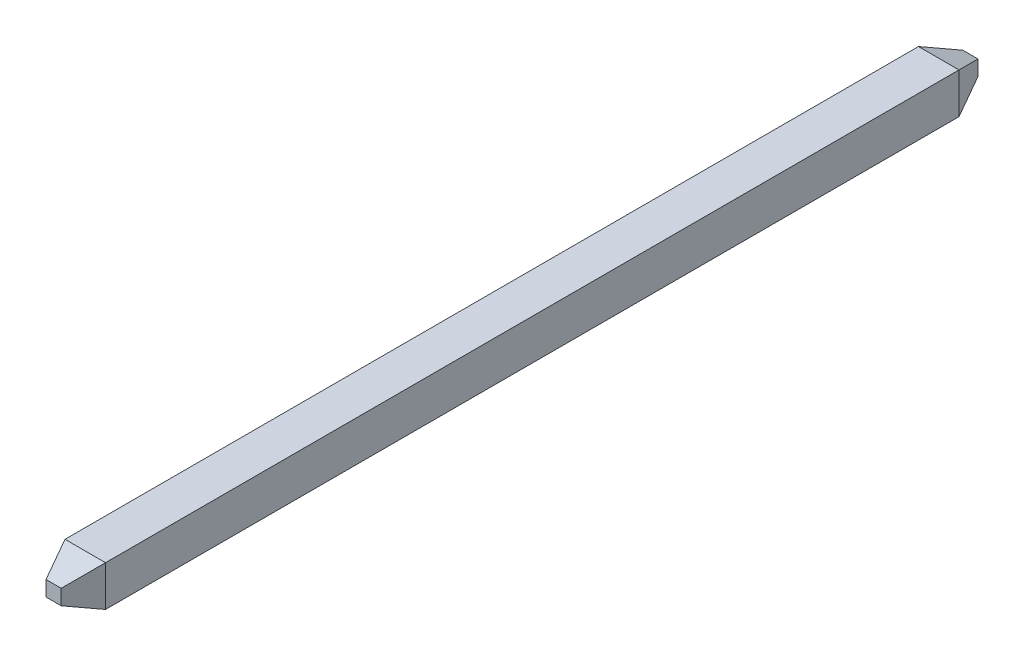
ISO-10303-21;
HEADER;
FILE_DESCRIPTION(('STEP AP214'),'2;1');
FILE_NAME('part.step','',(''),(''),'','','');
FILE_SCHEMA(('AUTOMOTIVE_DESIGN { 1 0 10303 214 1 1 1 1 }'));
ENDSEC;
DATA;
#1=APPLICATION_CONTEXT('core data for automotive mechanical design processes');
#2=APPLICATION_PROTOCOL_DEFINITION('international standard','automotive_design',2000,#1);
#3=PRODUCT_CONTEXT('',#1,'mechanical');
#4=PRODUCT('Part','Part','',(#3));
#5=PRODUCT_RELATED_PRODUCT_CATEGORY('part','',(#4));
#6=PRODUCT_DEFINITION_FORMATION('','',#4);
#7=PRODUCT_DEFINITION_CONTEXT('part definition',#1,'design');
#8=PRODUCT_DEFINITION('design','',#6,#7);
#9=PRODUCT_DEFINITION_SHAPE('','',#8);
#10=(LENGTH_UNIT() NAMED_UNIT(*) SI_UNIT(.MILLI.,.METRE.));
#11=(NAMED_UNIT(*) PLANE_ANGLE_UNIT() SI_UNIT($,.RADIAN.));
#12=(NAMED_UNIT(*) SI_UNIT($,.STERADIAN.) SOLID_ANGLE_UNIT());
#13=UNCERTAINTY_MEASURE_WITH_UNIT(LENGTH_MEASURE(1.E-05),#10,'distance_accuracy_value','');
#14=(GEOMETRIC_REPRESENTATION_CONTEXT(3) GLOBAL_UNCERTAINTY_ASSIGNED_CONTEXT((#13)) GLOBAL_UNIT_ASSIGNED_CONTEXT((#10,
#11,#12)) REPRESENTATION_CONTEXT('',''));
#15=CARTESIAN_POINT('',(0.,0.,0.));
#16=DIRECTION('',(0.,0.,1.));
#17=DIRECTION('',(1.,0.,0.));
#18=AXIS2_PLACEMENT_3D('',#15,#16,#17);
#19=CARTESIAN_POINT('',(-3.59,-0.0200000000000088,-3.31));
#20=DIRECTION('',(0.928476690885259,0.,-0.371390676354104));
#21=DIRECTION('',(-0.371390676354104,0.,-0.928476690885259));
#22=AXIS2_PLACEMENT_3D('',#19,#20,#21);
#23=PLANE('',#22);
#24=DIRECTION('',(0.,1.,0.));
#25=VECTOR('',#24,1.);
#26=CARTESIAN_POINT('',(-3.69,-0.139999999999999,-3.56));
#27=LINE('',#26,#25);
#28=CARTESIAN_POINT('',(-3.69,-0.139999999999999,-3.56));
#29=VERTEX_POINT('',#28);
#30=CARTESIAN_POINT('',(-3.69,0.0999999999999913,-3.56));
#31=VERTEX_POINT('',#30);
#32=EDGE_CURVE('E11',#29,#31,#27,.T.);
#33=ORIENTED_EDGE('',*,*,#32,.T.);
#34=DIRECTION('',(-0.348155311911244,-0.348155311911244,-0.87038827977861));
#35=VECTOR('',#34,1.);
#36=CARTESIAN_POINT('',(-3.49,0.300000000000001,-3.06));
#37=LINE('',#36,#35);
#38=CARTESIAN_POINT('',(-3.49,0.300000000000001,-3.06));
#39=VERTEX_POINT('',#38);
#40=EDGE_CURVE('E24',#39,#31,#37,.T.);
#41=ORIENTED_EDGE('',*,*,#40,.F.);
#42=DIRECTION('',(0.,1.,0.));
#43=VECTOR('',#42,1.);
#44=CARTESIAN_POINT('',(-3.49,-0.339999999999999,-3.06));
#45=LINE('',#44,#43);
#46=CARTESIAN_POINT('',(-3.49,-0.339999999999999,-3.06));
#47=VERTEX_POINT('',#46);
#48=EDGE_CURVE('E154',#47,#39,#45,.T.);
#49=ORIENTED_EDGE('',*,*,#48,.F.);
#50=DIRECTION('',(0.348155311911244,-0.348155311911244,0.87038827977861));
#51=VECTOR('',#50,1.);
#52=CARTESIAN_POINT('',(-3.69,-0.139999999999999,-3.56));
#53=LINE('',#52,#51);
#54=EDGE_CURVE('E151',#29,#47,#53,.T.);
#55=ORIENTED_EDGE('',*,*,#54,.F.);
#56=EDGE_LOOP('',(#33,#41,#49,#55));
#57=FACE_BOUND('',#56,.T.);
#58=ADVANCED_FACE('F17',(#57),#23,.T.);
#59=CARTESIAN_POINT('',(-4.03,-0.0199999999999988,10.67));
#60=DIRECTION('',(-0.928476690885259,0.,0.371390676354104));
#61=DIRECTION('',(0.371390676354104,0.,0.928476690885259));
#62=AXIS2_PLACEMENT_3D('',#59,#60,#61);
#63=PLANE('',#62);
#64=DIRECTION('',(0.,1.,0.));
#65=VECTOR('',#64,1.);
#66=CARTESIAN_POINT('',(-3.93,-0.139999999999999,10.92));
#67=LINE('',#66,#65);
#68=CARTESIAN_POINT('',(-3.93,-0.139999999999999,10.92));
#69=VERTEX_POINT('',#68);
#70=CARTESIAN_POINT('',(-3.93,0.0999999999999912,10.92));
#71=VERTEX_POINT('',#70);
#72=EDGE_CURVE('E149',#69,#71,#67,.T.);
#73=ORIENTED_EDGE('',*,*,#72,.T.);
#74=DIRECTION('',(0.348155311911244,-0.348155311911244,0.87038827977861));
#75=VECTOR('',#74,1.);
#76=CARTESIAN_POINT('',(-4.13,0.300000000000001,10.42));
#77=LINE('',#76,#75);
#78=CARTESIAN_POINT('',(-4.13,0.300000000000001,10.42));
#79=VERTEX_POINT('',#78);
#80=EDGE_CURVE('E146',#79,#71,#77,.T.);
#81=ORIENTED_EDGE('',*,*,#80,.F.);
#82=DIRECTION('',(0.,1.,0.));
#83=VECTOR('',#82,1.);
#84=CARTESIAN_POINT('',(-4.13,-0.339999999999999,10.42));
#85=LINE('',#84,#83);
#86=CARTESIAN_POINT('',(-4.13,-0.339999999999999,10.42));
#87=VERTEX_POINT('',#86);
#88=EDGE_CURVE('E143',#87,#79,#85,.T.);
#89=ORIENTED_EDGE('',*,*,#88,.F.);
#90=DIRECTION('',(-0.348155311911244,-0.348155311911244,-0.87038827977861));
#91=VECTOR('',#90,1.);
#92=CARTESIAN_POINT('',(-3.93,-0.139999999999999,10.92));
#93=LINE('',#92,#91);
#94=EDGE_CURVE('E140',#69,#87,#93,.T.);
#95=ORIENTED_EDGE('',*,*,#94,.F.);
#96=EDGE_LOOP('',(#73,#81,#89,#95));
#97=FACE_BOUND('',#96,.T.);
#98=ADVANCED_FACE('F184',(#97),#63,.T.);
#99=CARTESIAN_POINT('',(-3.81,-0.239999999999999,10.67));
#100=DIRECTION('',(0.,-0.928476690885259,0.371390676354104));
#101=DIRECTION('',(0.,-0.371390676354104,-0.928476690885259));
#102=AXIS2_PLACEMENT_3D('',#99,#100,#101);
#103=PLANE('',#102);
#104=DIRECTION('',(1.,0.,0.));
#105=VECTOR('',#104,1.);
#106=CARTESIAN_POINT('',(-3.93,-0.139999999999999,10.92));
#107=LINE('',#106,#105);
#108=CARTESIAN_POINT('',(-3.69,-0.139999999999999,10.92));
#109=VERTEX_POINT('',#108);
#110=EDGE_CURVE('E138',#69,#109,#107,.T.);
#111=ORIENTED_EDGE('',*,*,#110,.F.);
#112=ORIENTED_EDGE('',*,*,#94,.T.);
#113=DIRECTION('',(1.,0.,0.));
#114=VECTOR('',#113,1.);
#115=CARTESIAN_POINT('',(-4.13,-0.339999999999999,10.42));
#116=LINE('',#115,#114);
#117=CARTESIAN_POINT('',(-3.49,-0.339999999999999,10.42));
#118=VERTEX_POINT('',#117);
#119=EDGE_CURVE('E136',#87,#118,#116,.T.);
#120=ORIENTED_EDGE('',*,*,#119,.T.);
#121=DIRECTION('',(-0.348155311911244,0.348155311911244,0.87038827977861));
#122=VECTOR('',#121,1.);
#123=CARTESIAN_POINT('',(-3.49,-0.339999999999999,10.42));
#124=LINE('',#123,#122);
#125=EDGE_CURVE('E133',#118,#109,#124,.T.);
#126=ORIENTED_EDGE('',*,*,#125,.T.);
#127=EDGE_LOOP('',(#111,#112,#120,#126));
#128=FACE_BOUND('',#127,.T.);
#129=ADVANCED_FACE('F185',(#128),#103,.T.);
#130=CARTESIAN_POINT('',(-3.49,-0.339999999999999,10.92));
#131=DIRECTION('',(0.,0.,1.));
#132=DIRECTION('',(0.,1.,0.));
#133=AXIS2_PLACEMENT_3D('',#130,#131,#132);
#134=PLANE('',#133);
#135=ORIENTED_EDGE('',*,*,#110,.T.);
#136=DIRECTION('',(0.,-1.,0.));
#137=VECTOR('',#136,1.);
#138=CARTESIAN_POINT('',(-3.69,0.0999999999999912,10.92));
#139=LINE('',#138,#137);
#140=CARTESIAN_POINT('',(-3.69,0.0999999999999912,10.92));
#141=VERTEX_POINT('',#140);
#142=EDGE_CURVE('E130',#141,#109,#139,.T.);
#143=ORIENTED_EDGE('',*,*,#142,.F.);
#144=DIRECTION('',(1.,0.,0.));
#145=VECTOR('',#144,1.);
#146=CARTESIAN_POINT('',(-3.93,0.0999999999999912,10.92));
#147=LINE('',#146,#145);
#148=EDGE_CURVE('E127',#71,#141,#147,.T.);
#149=ORIENTED_EDGE('',*,*,#148,.F.);
#150=ORIENTED_EDGE('',*,*,#72,.F.);
#151=EDGE_LOOP('',(#135,#143,#149,#150));
#152=FACE_BOUND('',#151,.T.);
#153=ADVANCED_FACE('F187',(#152),#134,.T.);
#154=CARTESIAN_POINT('',(-3.81,0.200000000000001,10.67));
#155=DIRECTION('',(0.,0.928476690885259,0.371390676354104));
#156=DIRECTION('',(0.,-0.371390676354104,0.928476690885259));
#157=AXIS2_PLACEMENT_3D('',#154,#155,#156);
#158=PLANE('',#157);
#159=DIRECTION('',(1.,0.,0.));
#160=VECTOR('',#159,1.);
#161=CARTESIAN_POINT('',(-4.13,0.300000000000001,10.42));
#162=LINE('',#161,#160);
#163=CARTESIAN_POINT('',(-3.49,0.300000000000001,10.42));
#164=VERTEX_POINT('',#163);
#165=EDGE_CURVE('E125',#79,#164,#162,.T.);
#166=ORIENTED_EDGE('',*,*,#165,.F.);
#167=ORIENTED_EDGE('',*,*,#80,.T.);
#168=ORIENTED_EDGE('',*,*,#148,.T.);
#169=DIRECTION('',(0.348155311911244,0.348155311911244,-0.87038827977861));
#170=VECTOR('',#169,1.);
#171=CARTESIAN_POINT('',(-3.69,0.0999999999999912,10.92));
#172=LINE('',#171,#170);
#173=EDGE_CURVE('E122',#141,#164,#172,.T.);
#174=ORIENTED_EDGE('',*,*,#173,.T.);
#175=EDGE_LOOP('',(#166,#167,#168,#174));
#176=FACE_BOUND('',#175,.T.);
#177=ADVANCED_FACE('F167',(#176),#158,.T.);
#178=CARTESIAN_POINT('',(-3.49,-0.339999999999999,-3.56));
#179=DIRECTION('',(0.,-1.,0.));
#180=DIRECTION('',(0.,0.,1.));
#181=AXIS2_PLACEMENT_3D('',#178,#179,#180);
#182=PLANE('',#181);
#183=DIRECTION('',(0.,0.,1.));
#184=VECTOR('',#183,1.);
#185=CARTESIAN_POINT('',(-3.49,-0.339999999999999,3.16));
#186=LINE('',#185,#184);
#187=EDGE_CURVE('E119',#47,#118,#186,.T.);
#188=ORIENTED_EDGE('',*,*,#187,.T.);
#189=ORIENTED_EDGE('',*,*,#119,.F.);
#190=DIRECTION('',(0.,0.,1.));
#191=VECTOR('',#190,1.);
#192=CARTESIAN_POINT('',(-4.13,-0.339999999999999,-3.06));
#193=LINE('',#192,#191);
#194=CARTESIAN_POINT('',(-4.13,-0.339999999999999,-3.06));
#195=VERTEX_POINT('',#194);
#196=EDGE_CURVE('E116',#195,#87,#193,.T.);
#197=ORIENTED_EDGE('',*,*,#196,.F.);
#198=DIRECTION('',(1.,0.,0.));
#199=VECTOR('',#198,1.);
#200=CARTESIAN_POINT('',(-4.13,-0.339999999999999,-3.06));
#201=LINE('',#200,#199);
#202=EDGE_CURVE('E113',#195,#47,#201,.T.);
#203=ORIENTED_EDGE('',*,*,#202,.T.);
#204=EDGE_LOOP('',(#188,#189,#197,#203));
#205=FACE_BOUND('',#204,.T.);
#206=ADVANCED_FACE('F176',(#205),#182,.T.);
#207=CARTESIAN_POINT('',(-3.59,-0.0200000000000088,10.67));
#208=DIRECTION('',(0.928476690885259,0.,0.371390676354104));
#209=DIRECTION('',(-0.371390676354104,0.,0.928476690885259));
#210=AXIS2_PLACEMENT_3D('',#207,#208,#209);
#211=PLANE('',#210);
#212=ORIENTED_EDGE('',*,*,#142,.T.);
#213=ORIENTED_EDGE('',*,*,#125,.F.);
#214=DIRECTION('',(0.,-1.,0.));
#215=VECTOR('',#214,1.);
#216=CARTESIAN_POINT('',(-3.49,0.300000000000001,10.42));
#217=LINE('',#216,#215);
#218=EDGE_CURVE('E110',#164,#118,#217,.T.);
#219=ORIENTED_EDGE('',*,*,#218,.F.);
#220=ORIENTED_EDGE('',*,*,#173,.F.);
#221=EDGE_LOOP('',(#212,#213,#219,#220));
#222=FACE_BOUND('',#221,.T.);
#223=ADVANCED_FACE('F171',(#222),#211,.T.);
#224=CARTESIAN_POINT('',(-4.13,0.,1.58));
#225=DIRECTION('',(-1.,0.,0.));
#226=DIRECTION('',(0.,-1.,0.));
#227=AXIS2_PLACEMENT_3D('',#224,#225,#226);
#228=PLANE('',#227);
#229=DIRECTION('',(0.,0.,-1.));
#230=VECTOR('',#229,1.);
#231=CARTESIAN_POINT('',(-4.13,0.300000000000001,0.64));
#232=LINE('',#231,#230);
#233=CARTESIAN_POINT('',(-4.13,0.300000000000001,-3.06));
#234=VERTEX_POINT('',#233);
#235=EDGE_CURVE('E108',#79,#234,#232,.T.);
#236=ORIENTED_EDGE('',*,*,#235,.T.);
#237=DIRECTION('',(0.,-1.,0.));
#238=VECTOR('',#237,1.);
#239=CARTESIAN_POINT('',(-4.13,0.300000000000001,-3.06));
#240=LINE('',#239,#238);
#241=EDGE_CURVE('E93',#234,#195,#240,.T.);
#242=ORIENTED_EDGE('',*,*,#241,.T.);
#243=ORIENTED_EDGE('',*,*,#196,.T.);
#244=ORIENTED_EDGE('',*,*,#88,.T.);
#245=EDGE_LOOP('',(#236,#242,#243,#244));
#246=FACE_BOUND('',#245,.T.);
#247=ADVANCED_FACE('F181',(#246),#228,.T.);
#248=CARTESIAN_POINT('',(-3.49,0.,1.58));
#249=DIRECTION('',(-1.,0.,0.));
#250=DIRECTION('',(0.,-1.,0.));
#251=AXIS2_PLACEMENT_3D('',#248,#249,#250);
#252=PLANE('',#251);
#253=ORIENTED_EDGE('',*,*,#218,.T.);
#254=ORIENTED_EDGE('',*,*,#187,.F.);
#255=ORIENTED_EDGE('',*,*,#48,.T.);
#256=DIRECTION('',(0.,0.,-1.));
#257=VECTOR('',#256,1.);
#258=CARTESIAN_POINT('',(-3.49,0.300000000000001,10.16));
#259=LINE('',#258,#257);
#260=EDGE_CURVE('E104',#164,#39,#259,.T.);
#261=ORIENTED_EDGE('',*,*,#260,.F.);
#262=EDGE_LOOP('',(#253,#254,#255,#261));
#263=FACE_BOUND('',#262,.T.);
#264=ADVANCED_FACE('F159',(#263),#252,.F.);
#265=CARTESIAN_POINT('',(-3.49,0.300000000000001,10.66));
#266=DIRECTION('',(0.,1.,0.));
#267=DIRECTION('',(0.,0.,-1.));
#268=AXIS2_PLACEMENT_3D('',#265,#266,#267);
#269=PLANE('',#268);
#270=ORIENTED_EDGE('',*,*,#260,.T.);
#271=DIRECTION('',(1.,0.,0.));
#272=VECTOR('',#271,1.);
#273=CARTESIAN_POINT('',(-4.13,0.300000000000001,-3.06));
#274=LINE('',#273,#272);
#275=EDGE_CURVE('E85',#234,#39,#274,.T.);
#276=ORIENTED_EDGE('',*,*,#275,.F.);
#277=ORIENTED_EDGE('',*,*,#235,.F.);
#278=ORIENTED_EDGE('',*,*,#165,.T.);
#279=EDGE_LOOP('',(#270,#276,#277,#278));
#280=FACE_BOUND('',#279,.T.);
#281=ADVANCED_FACE('F161',(#280),#269,.T.);
#282=CARTESIAN_POINT('',(-4.03,-0.0199999999999888,-3.31));
#283=DIRECTION('',(-0.928476690885259,0.,-0.371390676354104));
#284=DIRECTION('',(0.371390676354104,0.,-0.928476690885259));
#285=AXIS2_PLACEMENT_3D('',#282,#283,#284);
#286=PLANE('',#285);
#287=DIRECTION('',(0.,-1.,0.));
#288=VECTOR('',#287,1.);
#289=CARTESIAN_POINT('',(-3.93,0.0999999999999913,-3.56));
#290=LINE('',#289,#288);
#291=CARTESIAN_POINT('',(-3.93,0.0999999999999913,-3.56));
#292=VERTEX_POINT('',#291);
#293=CARTESIAN_POINT('',(-3.93,-0.139999999999999,-3.56));
#294=VERTEX_POINT('',#293);
#295=EDGE_CURVE('E75',#292,#294,#290,.T.);
#296=ORIENTED_EDGE('',*,*,#295,.T.);
#297=DIRECTION('',(0.348155311911244,0.348155311911244,-0.87038827977861));
#298=VECTOR('',#297,1.);
#299=CARTESIAN_POINT('',(-4.13,-0.339999999999999,-3.06));
#300=LINE('',#299,#298);
#301=EDGE_CURVE('E86',#195,#294,#300,.T.);
#302=ORIENTED_EDGE('',*,*,#301,.F.);
#303=ORIENTED_EDGE('',*,*,#241,.F.);
#304=DIRECTION('',(-0.348155311911244,0.348155311911244,0.87038827977861));
#305=VECTOR('',#304,1.);
#306=CARTESIAN_POINT('',(-3.93,0.0999999999999913,-3.56));
#307=LINE('',#306,#305);
#308=EDGE_CURVE('E90',#292,#234,#307,.T.);
#309=ORIENTED_EDGE('',*,*,#308,.F.);
#310=EDGE_LOOP('',(#296,#302,#303,#309));
#311=FACE_BOUND('',#310,.T.);
#312=ADVANCED_FACE('F91',(#311),#286,.T.);
#313=CARTESIAN_POINT('',(-3.81,-0.239999999999999,-3.31));
#314=DIRECTION('',(0.,-0.928476690885259,-0.371390676354104));
#315=DIRECTION('',(0.,0.371390676354104,-0.928476690885259));
#316=AXIS2_PLACEMENT_3D('',#313,#314,#315);
#317=PLANE('',#316);
#318=ORIENTED_EDGE('',*,*,#202,.F.);
#319=ORIENTED_EDGE('',*,*,#301,.T.);
#320=DIRECTION('',(1.,0.,0.));
#321=VECTOR('',#320,1.);
#322=CARTESIAN_POINT('',(-3.93,-0.139999999999999,-3.56));
#323=LINE('',#322,#321);
#324=EDGE_CURVE('E81',#294,#29,#323,.T.);
#325=ORIENTED_EDGE('',*,*,#324,.T.);
#326=ORIENTED_EDGE('',*,*,#54,.T.);
#327=EDGE_LOOP('',(#318,#319,#325,#326));
#328=FACE_BOUND('',#327,.T.);
#329=ADVANCED_FACE('F179',(#328),#317,.T.);
#330=CARTESIAN_POINT('',(-3.81,0.200000000000001,-3.31));
#331=DIRECTION('',(0.,0.928476690885259,-0.371390676354104));
#332=DIRECTION('',(0.,0.371390676354104,0.928476690885259));
#333=AXIS2_PLACEMENT_3D('',#330,#331,#332);
#334=PLANE('',#333);
#335=DIRECTION('',(1.,0.,0.));
#336=VECTOR('',#335,1.);
#337=CARTESIAN_POINT('',(-3.93,0.0999999999999913,-3.56));
#338=LINE('',#337,#336);
#339=EDGE_CURVE('E79',#292,#31,#338,.T.);
#340=ORIENTED_EDGE('',*,*,#339,.F.);
#341=ORIENTED_EDGE('',*,*,#308,.T.);
#342=ORIENTED_EDGE('',*,*,#275,.T.);
#343=ORIENTED_EDGE('',*,*,#40,.T.);
#344=EDGE_LOOP('',(#340,#341,#342,#343));
#345=FACE_BOUND('',#344,.T.);
#346=ADVANCED_FACE('F98',(#345),#334,.T.);
#347=CARTESIAN_POINT('',(-3.49,0.300000000000001,-3.56));
#348=DIRECTION('',(0.,0.,-1.));
#349=DIRECTION('',(0.,-1.,0.));
#350=AXIS2_PLACEMENT_3D('',#347,#348,#349);
#351=PLANE('',#350);
#352=ORIENTED_EDGE('',*,*,#339,.T.);
#353=ORIENTED_EDGE('',*,*,#32,.F.);
#354=ORIENTED_EDGE('',*,*,#324,.F.);
#355=ORIENTED_EDGE('',*,*,#295,.F.);
#356=EDGE_LOOP('',(#352,#353,#354,#355));
#357=FACE_BOUND('',#356,.T.);
#358=ADVANCED_FACE('F77',(#357),#351,.T.);
#359=CLOSED_SHELL('',(#58,#98,#129,#153,#177,#206,#223,#247,#264,#281,#312,#329,#346,#358));
#360=MANIFOLD_SOLID_BREP('B1',#359);
#361=ADVANCED_BREP_SHAPE_REPRESENTATION('',(#18,#360),#14);
#362=SHAPE_DEFINITION_REPRESENTATION(#9,#361);
ENDSEC;
END-ISO-10303-21;
